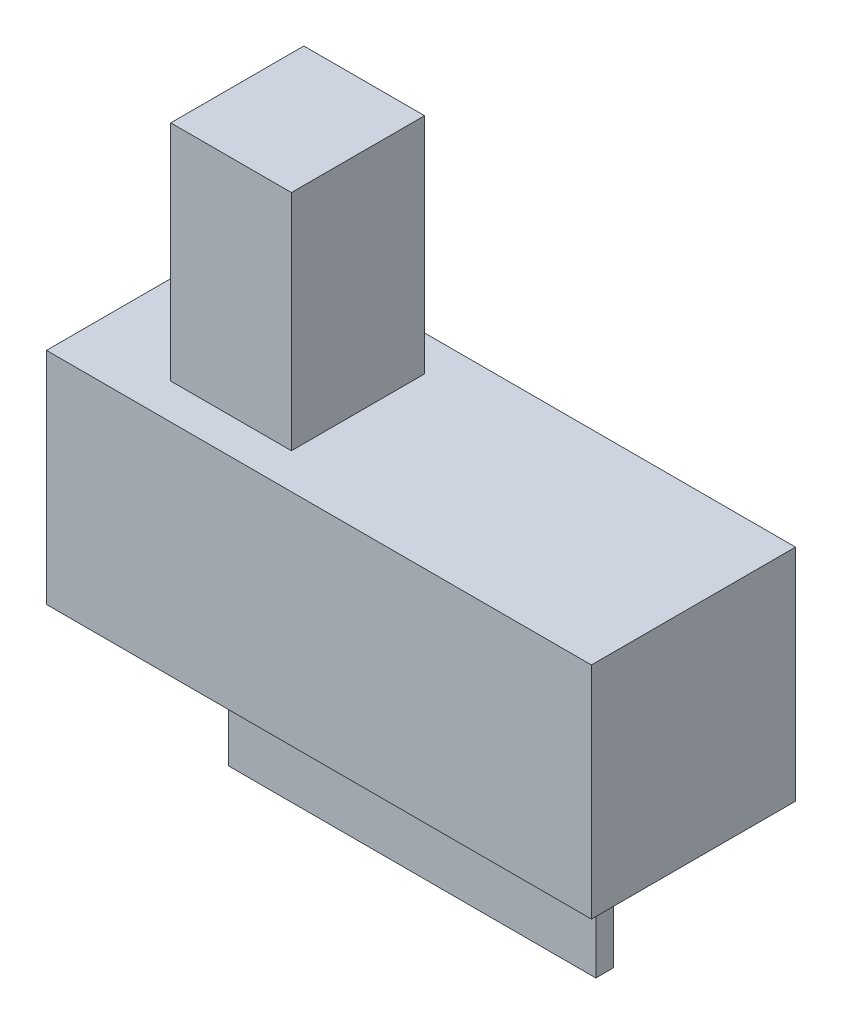
ISO-10303-21;
HEADER;
FILE_DESCRIPTION(('STEP AP214'),'2;1');
FILE_NAME('part.step','',(''),(''),'','','');
FILE_SCHEMA(('AUTOMOTIVE_DESIGN { 1 0 10303 214 1 1 1 1 }'));
ENDSEC;
DATA;
#1=APPLICATION_CONTEXT('core data for automotive mechanical design processes');
#2=APPLICATION_PROTOCOL_DEFINITION('international standard','automotive_design',2000,#1);
#3=PRODUCT_CONTEXT('',#1,'mechanical');
#4=PRODUCT('Part','Part','',(#3));
#5=PRODUCT_RELATED_PRODUCT_CATEGORY('part','',(#4));
#6=PRODUCT_DEFINITION_FORMATION('','',#4);
#7=PRODUCT_DEFINITION_CONTEXT('part definition',#1,'design');
#8=PRODUCT_DEFINITION('design','',#6,#7);
#9=PRODUCT_DEFINITION_SHAPE('','',#8);
#10=(LENGTH_UNIT() NAMED_UNIT(*) SI_UNIT(.MILLI.,.METRE.));
#11=(NAMED_UNIT(*) PLANE_ANGLE_UNIT() SI_UNIT($,.RADIAN.));
#12=(NAMED_UNIT(*) SI_UNIT($,.STERADIAN.) SOLID_ANGLE_UNIT());
#13=UNCERTAINTY_MEASURE_WITH_UNIT(LENGTH_MEASURE(1.E-05),#10,'distance_accuracy_value','');
#14=(GEOMETRIC_REPRESENTATION_CONTEXT(3) GLOBAL_UNCERTAINTY_ASSIGNED_CONTEXT((#13)) GLOBAL_UNIT_ASSIGNED_CONTEXT((#10,
#11,#12)) REPRESENTATION_CONTEXT('',''));
#15=CARTESIAN_POINT('',(0.,0.,0.));
#16=DIRECTION('',(0.,0.,1.));
#17=DIRECTION('',(1.,0.,0.));
#18=AXIS2_PLACEMENT_3D('',#15,#16,#17);
#19=CARTESIAN_POINT('',(0.,-6.2,0.));
#20=DIRECTION('',(0.,1.,0.));
#21=DIRECTION('',(0.,0.,1.));
#22=AXIS2_PLACEMENT_3D('',#19,#20,#21);
#23=PLANE('',#22);
#24=DIRECTION('',(1.,0.,0.));
#25=VECTOR('',#24,1.);
#26=CARTESIAN_POINT('',(0.,-6.2,0.));
#27=LINE('',#26,#25);
#28=CARTESIAN_POINT('',(0.,-6.2,0.));
#29=VERTEX_POINT('',#28);
#30=CARTESIAN_POINT('',(15.35,-6.2,0.));
#31=VERTEX_POINT('',#30);
#32=EDGE_CURVE('E204',#29,#31,#27,.T.);
#33=ORIENTED_EDGE('',*,*,#32,.F.);
#34=DIRECTION('',(0.,0.,-1.));
#35=VECTOR('',#34,1.);
#36=CARTESIAN_POINT('',(0.,-6.2,0.));
#37=LINE('',#36,#35);
#38=CARTESIAN_POINT('',(0.,-6.2,-5.75));
#39=VERTEX_POINT('',#38);
#40=EDGE_CURVE('E216',#29,#39,#37,.T.);
#41=ORIENTED_EDGE('',*,*,#40,.T.);
#42=DIRECTION('',(1.,0.,0.));
#43=VECTOR('',#42,1.);
#44=CARTESIAN_POINT('',(0.,-6.2,-5.75));
#45=LINE('',#44,#43);
#46=CARTESIAN_POINT('',(15.35,-6.2,-5.75));
#47=VERTEX_POINT('',#46);
#48=EDGE_CURVE('E213',#39,#47,#45,.T.);
#49=ORIENTED_EDGE('',*,*,#48,.T.);
#50=DIRECTION('',(0.,0.,-1.));
#51=VECTOR('',#50,1.);
#52=CARTESIAN_POINT('',(15.35,-6.2,0.));
#53=LINE('',#52,#51);
#54=EDGE_CURVE('E208',#31,#47,#53,.T.);
#55=ORIENTED_EDGE('',*,*,#54,.F.);
#56=EDGE_LOOP('',(#33,#41,#49,#55));
#57=FACE_BOUND('',#56,.T.);
#58=DIRECTION('',(1.,0.,0.));
#59=VECTOR('',#58,1.);
#60=CARTESIAN_POINT('',(12.85,-6.2,-3.125));
#61=LINE('',#60,#59);
#62=CARTESIAN_POINT('',(2.5,-6.2,-3.125));
#63=VERTEX_POINT('',#62);
#64=CARTESIAN_POINT('',(12.85,-6.2,-3.125));
#65=VERTEX_POINT('',#64);
#66=EDGE_CURVE('E259',#63,#65,#61,.T.);
#67=ORIENTED_EDGE('',*,*,#66,.F.);
#68=DIRECTION('',(0.,0.,-1.));
#69=VECTOR('',#68,1.);
#70=CARTESIAN_POINT('',(2.5,-6.2,-2.875));
#71=LINE('',#70,#69);
#72=CARTESIAN_POINT('',(2.5,-6.2,-2.625));
#73=VERTEX_POINT('',#72);
#74=EDGE_CURVE('E151',#73,#63,#71,.T.);
#75=ORIENTED_EDGE('',*,*,#74,.F.);
#76=DIRECTION('',(-1.,0.,0.));
#77=VECTOR('',#76,1.);
#78=CARTESIAN_POINT('',(12.85,-6.2,-2.625));
#79=LINE('',#78,#77);
#80=CARTESIAN_POINT('',(12.85,-6.2,-2.625));
#81=VERTEX_POINT('',#80);
#82=EDGE_CURVE('E64',#81,#73,#79,.T.);
#83=ORIENTED_EDGE('',*,*,#82,.F.);
#84=DIRECTION('',(0.,0.,1.));
#85=VECTOR('',#84,1.);
#86=CARTESIAN_POINT('',(12.85,-6.2,-2.875));
#87=LINE('',#86,#85);
#88=EDGE_CURVE('E59',#65,#81,#87,.T.);
#89=ORIENTED_EDGE('',*,*,#88,.F.);
#90=EDGE_LOOP('',(#67,#75,#83,#89));
#91=FACE_BOUND('',#90,.T.);
#92=ADVANCED_FACE('F41',(#57,#91),#23,.F.);
#93=CARTESIAN_POINT('',(0.,-6.2,0.));
#94=DIRECTION('',(0.,0.,1.));
#95=DIRECTION('',(1.,0.,0.));
#96=AXIS2_PLACEMENT_3D('',#93,#94,#95);
#97=PLANE('',#96);
#98=DIRECTION('',(1.,0.,0.));
#99=VECTOR('',#98,1.);
#100=CARTESIAN_POINT('',(0.,0.,0.));
#101=LINE('',#100,#99);
#102=CARTESIAN_POINT('',(0.,0.,0.));
#103=VERTEX_POINT('',#102);
#104=CARTESIAN_POINT('',(15.35,0.,0.));
#105=VERTEX_POINT('',#104);
#106=EDGE_CURVE('E203',#103,#105,#101,.T.);
#107=ORIENTED_EDGE('',*,*,#106,.F.);
#108=DIRECTION('',(0.,1.,0.));
#109=VECTOR('',#108,1.);
#110=CARTESIAN_POINT('',(0.,-6.2,0.));
#111=LINE('',#110,#109);
#112=EDGE_CURVE('E11',#29,#103,#111,.T.);
#113=ORIENTED_EDGE('',*,*,#112,.F.);
#114=ORIENTED_EDGE('',*,*,#32,.T.);
#115=DIRECTION('',(0.,1.,0.));
#116=VECTOR('',#115,1.);
#117=CARTESIAN_POINT('',(15.35,-6.2,0.));
#118=LINE('',#117,#116);
#119=EDGE_CURVE('E45',#31,#105,#118,.T.);
#120=ORIENTED_EDGE('',*,*,#119,.T.);
#121=EDGE_LOOP('',(#107,#113,#114,#120));
#122=FACE_BOUND('',#121,.T.);
#123=ADVANCED_FACE('F43',(#122),#97,.T.);
#124=CARTESIAN_POINT('',(0.,-6.2,0.));
#125=DIRECTION('',(1.,0.,0.));
#126=DIRECTION('',(0.,0.,-1.));
#127=AXIS2_PLACEMENT_3D('',#124,#125,#126);
#128=PLANE('',#127);
#129=DIRECTION('',(0.,0.,-1.));
#130=VECTOR('',#129,1.);
#131=CARTESIAN_POINT('',(0.,0.,0.));
#132=LINE('',#131,#130);
#133=CARTESIAN_POINT('',(0.,0.,-5.75));
#134=VERTEX_POINT('',#133);
#135=EDGE_CURVE('E209',#103,#134,#132,.T.);
#136=ORIENTED_EDGE('',*,*,#135,.T.);
#137=DIRECTION('',(0.,1.,0.));
#138=VECTOR('',#137,1.);
#139=CARTESIAN_POINT('',(0.,-6.2,-5.75));
#140=LINE('',#139,#138);
#141=EDGE_CURVE('E51',#39,#134,#140,.T.);
#142=ORIENTED_EDGE('',*,*,#141,.F.);
#143=ORIENTED_EDGE('',*,*,#40,.F.);
#144=ORIENTED_EDGE('',*,*,#112,.T.);
#145=EDGE_LOOP('',(#136,#142,#143,#144));
#146=FACE_BOUND('',#145,.T.);
#147=ADVANCED_FACE('F251',(#146),#128,.F.);
#148=CARTESIAN_POINT('',(0.,-6.2,-5.75));
#149=DIRECTION('',(0.,0.,1.));
#150=DIRECTION('',(1.,0.,0.));
#151=AXIS2_PLACEMENT_3D('',#148,#149,#150);
#152=PLANE('',#151);
#153=DIRECTION('',(1.,0.,0.));
#154=VECTOR('',#153,1.);
#155=CARTESIAN_POINT('',(0.,0.,-5.75));
#156=LINE('',#155,#154);
#157=CARTESIAN_POINT('',(15.35,0.,-5.75));
#158=VERTEX_POINT('',#157);
#159=EDGE_CURVE('E226',#134,#158,#156,.T.);
#160=ORIENTED_EDGE('',*,*,#159,.T.);
#161=DIRECTION('',(0.,1.,0.));
#162=VECTOR('',#161,1.);
#163=CARTESIAN_POINT('',(15.35,-6.2,-5.75));
#164=LINE('',#163,#162);
#165=EDGE_CURVE('E234',#47,#158,#164,.T.);
#166=ORIENTED_EDGE('',*,*,#165,.F.);
#167=ORIENTED_EDGE('',*,*,#48,.F.);
#168=ORIENTED_EDGE('',*,*,#141,.T.);
#169=EDGE_LOOP('',(#160,#166,#167,#168));
#170=FACE_BOUND('',#169,.T.);
#171=ADVANCED_FACE('F255',(#170),#152,.F.);
#172=CARTESIAN_POINT('',(15.35,-6.2,0.));
#173=DIRECTION('',(1.,0.,0.));
#174=DIRECTION('',(0.,0.,-1.));
#175=AXIS2_PLACEMENT_3D('',#172,#173,#174);
#176=PLANE('',#175);
#177=DIRECTION('',(0.,0.,-1.));
#178=VECTOR('',#177,1.);
#179=CARTESIAN_POINT('',(15.35,0.,0.));
#180=LINE('',#179,#178);
#181=EDGE_CURVE('E222',#105,#158,#180,.T.);
#182=ORIENTED_EDGE('',*,*,#181,.F.);
#183=ORIENTED_EDGE('',*,*,#119,.F.);
#184=ORIENTED_EDGE('',*,*,#54,.T.);
#185=ORIENTED_EDGE('',*,*,#165,.T.);
#186=EDGE_LOOP('',(#182,#183,#184,#185));
#187=FACE_BOUND('',#186,.T.);
#188=ADVANCED_FACE('F244',(#187),#176,.T.);
#189=CARTESIAN_POINT('',(0.,0.,0.));
#190=DIRECTION('',(0.,1.,0.));
#191=DIRECTION('',(0.,0.,1.));
#192=AXIS2_PLACEMENT_3D('',#189,#190,#191);
#193=PLANE('',#192);
#194=DIRECTION('',(0.,0.,1.));
#195=VECTOR('',#194,1.);
#196=CARTESIAN_POINT('',(5.9,0.,0.));
#197=LINE('',#196,#195);
#198=CARTESIAN_POINT('',(5.9,0.,-4.75));
#199=VERTEX_POINT('',#198);
#200=CARTESIAN_POINT('',(5.9,0.,-1.));
#201=VERTEX_POINT('',#200);
#202=EDGE_CURVE('E156',#199,#201,#197,.T.);
#203=ORIENTED_EDGE('',*,*,#202,.T.);
#204=DIRECTION('',(1.,0.,0.));
#205=VECTOR('',#204,1.);
#206=CARTESIAN_POINT('',(0.,0.,-1.));
#207=LINE('',#206,#205);
#208=CARTESIAN_POINT('',(2.5,0.,-1.));
#209=VERTEX_POINT('',#208);
#210=EDGE_CURVE('E172',#209,#201,#207,.T.);
#211=ORIENTED_EDGE('',*,*,#210,.F.);
#212=DIRECTION('',(0.,0.,1.));
#213=VECTOR('',#212,1.);
#214=CARTESIAN_POINT('',(2.5,0.,0.));
#215=LINE('',#214,#213);
#216=CARTESIAN_POINT('',(2.5,0.,-4.75));
#217=VERTEX_POINT('',#216);
#218=EDGE_CURVE('E184',#217,#209,#215,.T.);
#219=ORIENTED_EDGE('',*,*,#218,.F.);
#220=DIRECTION('',(-1.,0.,0.));
#221=VECTOR('',#220,1.);
#222=CARTESIAN_POINT('',(0.,0.,-4.75));
#223=LINE('',#222,#221);
#224=EDGE_CURVE('E161',#199,#217,#223,.T.);
#225=ORIENTED_EDGE('',*,*,#224,.F.);
#226=EDGE_LOOP('',(#203,#211,#219,#225));
#227=FACE_BOUND('',#226,.T.);
#228=ORIENTED_EDGE('',*,*,#106,.T.);
#229=ORIENTED_EDGE('',*,*,#181,.T.);
#230=ORIENTED_EDGE('',*,*,#159,.F.);
#231=ORIENTED_EDGE('',*,*,#135,.F.);
#232=EDGE_LOOP('',(#228,#229,#230,#231));
#233=FACE_BOUND('',#232,.T.);
#234=ADVANCED_FACE('F248',(#227,#233),#193,.T.);
#235=CARTESIAN_POINT('',(5.9,6.3,0.));
#236=DIRECTION('',(1.,0.,0.));
#237=DIRECTION('',(0.,0.,-1.));
#238=AXIS2_PLACEMENT_3D('',#235,#236,#237);
#239=PLANE('',#238);
#240=ORIENTED_EDGE('',*,*,#202,.F.);
#241=DIRECTION('',(0.,-1.,0.));
#242=VECTOR('',#241,1.);
#243=CARTESIAN_POINT('',(5.9,6.3,-4.75));
#244=LINE('',#243,#242);
#245=CARTESIAN_POINT('',(5.9,6.3,-4.75));
#246=VERTEX_POINT('',#245);
#247=EDGE_CURVE('E200',#246,#199,#244,.T.);
#248=ORIENTED_EDGE('',*,*,#247,.F.);
#249=DIRECTION('',(0.,0.,1.));
#250=VECTOR('',#249,1.);
#251=CARTESIAN_POINT('',(5.9,6.3,0.));
#252=LINE('',#251,#250);
#253=CARTESIAN_POINT('',(5.9,6.3,-1.));
#254=VERTEX_POINT('',#253);
#255=EDGE_CURVE('E167',#246,#254,#252,.T.);
#256=ORIENTED_EDGE('',*,*,#255,.T.);
#257=DIRECTION('',(0.,-1.,0.));
#258=VECTOR('',#257,1.);
#259=CARTESIAN_POINT('',(5.9,6.3,-1.));
#260=LINE('',#259,#258);
#261=EDGE_CURVE('E180',#254,#201,#260,.T.);
#262=ORIENTED_EDGE('',*,*,#261,.T.);
#263=EDGE_LOOP('',(#240,#248,#256,#262));
#264=FACE_BOUND('',#263,.T.);
#265=ADVANCED_FACE('F307',(#264),#239,.T.);
#266=CARTESIAN_POINT('',(0.,6.3,-4.75));
#267=DIRECTION('',(0.,0.,1.));
#268=DIRECTION('',(1.,0.,0.));
#269=AXIS2_PLACEMENT_3D('',#266,#267,#268);
#270=PLANE('',#269);
#271=ORIENTED_EDGE('',*,*,#224,.T.);
#272=DIRECTION('',(0.,-1.,0.));
#273=VECTOR('',#272,1.);
#274=CARTESIAN_POINT('',(2.5,6.3,-4.75));
#275=LINE('',#274,#273);
#276=CARTESIAN_POINT('',(2.5,6.3,-4.75));
#277=VERTEX_POINT('',#276);
#278=EDGE_CURVE('E196',#277,#217,#275,.T.);
#279=ORIENTED_EDGE('',*,*,#278,.F.);
#280=DIRECTION('',(-1.,0.,0.));
#281=VECTOR('',#280,1.);
#282=CARTESIAN_POINT('',(0.,6.3,-4.75));
#283=LINE('',#282,#281);
#284=EDGE_CURVE('E171',#246,#277,#283,.T.);
#285=ORIENTED_EDGE('',*,*,#284,.F.);
#286=ORIENTED_EDGE('',*,*,#247,.T.);
#287=EDGE_LOOP('',(#271,#279,#285,#286));
#288=FACE_BOUND('',#287,.T.);
#289=ADVANCED_FACE('F303',(#288),#270,.F.);
#290=CARTESIAN_POINT('',(2.5,6.3,0.));
#291=DIRECTION('',(1.,0.,0.));
#292=DIRECTION('',(0.,0.,-1.));
#293=AXIS2_PLACEMENT_3D('',#290,#291,#292);
#294=PLANE('',#293);
#295=ORIENTED_EDGE('',*,*,#218,.T.);
#296=DIRECTION('',(0.,-1.,0.));
#297=VECTOR('',#296,1.);
#298=CARTESIAN_POINT('',(2.5,6.3,-1.));
#299=LINE('',#298,#297);
#300=CARTESIAN_POINT('',(2.5,6.3,-1.));
#301=VERTEX_POINT('',#300);
#302=EDGE_CURVE('E193',#301,#209,#299,.T.);
#303=ORIENTED_EDGE('',*,*,#302,.F.);
#304=DIRECTION('',(0.,0.,1.));
#305=VECTOR('',#304,1.);
#306=CARTESIAN_POINT('',(2.5,6.3,0.));
#307=LINE('',#306,#305);
#308=EDGE_CURVE('E175',#277,#301,#307,.T.);
#309=ORIENTED_EDGE('',*,*,#308,.F.);
#310=ORIENTED_EDGE('',*,*,#278,.T.);
#311=EDGE_LOOP('',(#295,#303,#309,#310));
#312=FACE_BOUND('',#311,.T.);
#313=ADVANCED_FACE('F299',(#312),#294,.F.);
#314=CARTESIAN_POINT('',(0.,6.3,-1.));
#315=DIRECTION('',(0.,0.,-1.));
#316=DIRECTION('',(-1.,0.,0.));
#317=AXIS2_PLACEMENT_3D('',#314,#315,#316);
#318=PLANE('',#317);
#319=ORIENTED_EDGE('',*,*,#210,.T.);
#320=ORIENTED_EDGE('',*,*,#261,.F.);
#321=DIRECTION('',(1.,0.,0.));
#322=VECTOR('',#321,1.);
#323=CARTESIAN_POINT('',(0.,6.3,-1.));
#324=LINE('',#323,#322);
#325=EDGE_CURVE('E178',#301,#254,#324,.T.);
#326=ORIENTED_EDGE('',*,*,#325,.F.);
#327=ORIENTED_EDGE('',*,*,#302,.T.);
#328=EDGE_LOOP('',(#319,#320,#326,#327));
#329=FACE_BOUND('',#328,.T.);
#330=ADVANCED_FACE('F295',(#329),#318,.F.);
#331=CARTESIAN_POINT('',(0.,6.3,0.));
#332=DIRECTION('',(0.,1.,0.));
#333=DIRECTION('',(0.,0.,1.));
#334=AXIS2_PLACEMENT_3D('',#331,#332,#333);
#335=PLANE('',#334);
#336=ORIENTED_EDGE('',*,*,#255,.F.);
#337=ORIENTED_EDGE('',*,*,#284,.T.);
#338=ORIENTED_EDGE('',*,*,#308,.T.);
#339=ORIENTED_EDGE('',*,*,#325,.T.);
#340=EDGE_LOOP('',(#336,#337,#338,#339));
#341=FACE_BOUND('',#340,.T.);
#342=ADVANCED_FACE('F289',(#341),#335,.T.);
#343=CARTESIAN_POINT('',(12.85,-10.2,-3.125));
#344=DIRECTION('',(0.,0.,1.));
#345=DIRECTION('',(1.,0.,0.));
#346=AXIS2_PLACEMENT_3D('',#343,#344,#345);
#347=PLANE('',#346);
#348=ORIENTED_EDGE('',*,*,#66,.T.);
#349=DIRECTION('',(0.,1.,0.));
#350=VECTOR('',#349,1.);
#351=CARTESIAN_POINT('',(12.85,-10.2,-3.125));
#352=LINE('',#351,#350);
#353=CARTESIAN_POINT('',(12.85,-10.2,-3.125));
#354=VERTEX_POINT('',#353);
#355=EDGE_CURVE('E136',#354,#65,#352,.T.);
#356=ORIENTED_EDGE('',*,*,#355,.F.);
#357=DIRECTION('',(1.,0.,0.));
#358=VECTOR('',#357,1.);
#359=CARTESIAN_POINT('',(12.85,-10.2,-3.125));
#360=LINE('',#359,#358);
#361=CARTESIAN_POINT('',(2.5,-10.2,-3.125));
#362=VERTEX_POINT('',#361);
#363=EDGE_CURVE('E130',#362,#354,#360,.T.);
#364=ORIENTED_EDGE('',*,*,#363,.F.);
#365=DIRECTION('',(0.,1.,0.));
#366=VECTOR('',#365,1.);
#367=CARTESIAN_POINT('',(2.5,-10.2,-3.125));
#368=LINE('',#367,#366);
#369=EDGE_CURVE('E134',#362,#63,#368,.T.);
#370=ORIENTED_EDGE('',*,*,#369,.T.);
#371=EDGE_LOOP('',(#348,#356,#364,#370));
#372=FACE_BOUND('',#371,.T.);
#373=ADVANCED_FACE('F132',(#372),#347,.F.);
#374=CARTESIAN_POINT('',(12.85,-10.2,-2.875));
#375=DIRECTION('',(-1.,0.,0.));
#376=DIRECTION('',(0.,0.,1.));
#377=AXIS2_PLACEMENT_3D('',#374,#375,#376);
#378=PLANE('',#377);
#379=ORIENTED_EDGE('',*,*,#88,.T.);
#380=DIRECTION('',(0.,1.,0.));
#381=VECTOR('',#380,1.);
#382=CARTESIAN_POINT('',(12.85,-10.2,-2.625));
#383=LINE('',#382,#381);
#384=CARTESIAN_POINT('',(12.85,-10.2,-2.625));
#385=VERTEX_POINT('',#384);
#386=EDGE_CURVE('E163',#385,#81,#383,.T.);
#387=ORIENTED_EDGE('',*,*,#386,.F.);
#388=DIRECTION('',(0.,0.,1.));
#389=VECTOR('',#388,1.);
#390=CARTESIAN_POINT('',(12.85,-10.2,-2.875));
#391=LINE('',#390,#389);
#392=EDGE_CURVE('E140',#354,#385,#391,.T.);
#393=ORIENTED_EDGE('',*,*,#392,.F.);
#394=ORIENTED_EDGE('',*,*,#355,.T.);
#395=EDGE_LOOP('',(#379,#387,#393,#394));
#396=FACE_BOUND('',#395,.T.);
#397=ADVANCED_FACE('F279',(#396),#378,.F.);
#398=CARTESIAN_POINT('',(12.85,-10.2,-2.625));
#399=DIRECTION('',(0.,0.,-1.));
#400=DIRECTION('',(-1.,0.,0.));
#401=AXIS2_PLACEMENT_3D('',#398,#399,#400);
#402=PLANE('',#401);
#403=ORIENTED_EDGE('',*,*,#82,.T.);
#404=DIRECTION('',(0.,1.,0.));
#405=VECTOR('',#404,1.);
#406=CARTESIAN_POINT('',(2.5,-10.2,-2.625));
#407=LINE('',#406,#405);
#408=CARTESIAN_POINT('',(2.5,-10.2,-2.625));
#409=VERTEX_POINT('',#408);
#410=EDGE_CURVE('E271',#409,#73,#407,.T.);
#411=ORIENTED_EDGE('',*,*,#410,.F.);
#412=DIRECTION('',(-1.,0.,0.));
#413=VECTOR('',#412,1.);
#414=CARTESIAN_POINT('',(12.85,-10.2,-2.625));
#415=LINE('',#414,#413);
#416=EDGE_CURVE('E146',#385,#409,#415,.T.);
#417=ORIENTED_EDGE('',*,*,#416,.F.);
#418=ORIENTED_EDGE('',*,*,#386,.T.);
#419=EDGE_LOOP('',(#403,#411,#417,#418));
#420=FACE_BOUND('',#419,.T.);
#421=ADVANCED_FACE('F277',(#420),#402,.F.);
#422=CARTESIAN_POINT('',(2.5,-10.2,-2.875));
#423=DIRECTION('',(1.,0.,0.));
#424=DIRECTION('',(0.,0.,-1.));
#425=AXIS2_PLACEMENT_3D('',#422,#423,#424);
#426=PLANE('',#425);
#427=ORIENTED_EDGE('',*,*,#74,.T.);
#428=ORIENTED_EDGE('',*,*,#369,.F.);
#429=DIRECTION('',(0.,0.,-1.));
#430=VECTOR('',#429,1.);
#431=CARTESIAN_POINT('',(2.5,-10.2,-2.875));
#432=LINE('',#431,#430);
#433=EDGE_CURVE('E141',#409,#362,#432,.T.);
#434=ORIENTED_EDGE('',*,*,#433,.F.);
#435=ORIENTED_EDGE('',*,*,#410,.T.);
#436=EDGE_LOOP('',(#427,#428,#434,#435));
#437=FACE_BOUND('',#436,.T.);
#438=ADVANCED_FACE('F154',(#437),#426,.F.);
#439=CARTESIAN_POINT('',(0.,-10.2,0.));
#440=DIRECTION('',(0.,1.,0.));
#441=DIRECTION('',(0.,0.,1.));
#442=AXIS2_PLACEMENT_3D('',#439,#440,#441);
#443=PLANE('',#442);
#444=ORIENTED_EDGE('',*,*,#433,.T.);
#445=ORIENTED_EDGE('',*,*,#363,.T.);
#446=ORIENTED_EDGE('',*,*,#392,.T.);
#447=ORIENTED_EDGE('',*,*,#416,.T.);
#448=EDGE_LOOP('',(#444,#445,#446,#447));
#449=FACE_BOUND('',#448,.T.);
#450=ADVANCED_FACE('F144',(#449),#443,.F.);
#451=CLOSED_SHELL('',(#92,#123,#147,#171,#188,#234,#265,#289,#313,#330,#342,#373,#397,#421,#438,#450));
#452=MANIFOLD_SOLID_BREP('B2',#451);
#453=ADVANCED_BREP_SHAPE_REPRESENTATION('',(#18,#452),#14);
#454=SHAPE_DEFINITION_REPRESENTATION(#9,#453);
ENDSEC;
END-ISO-10303-21;
